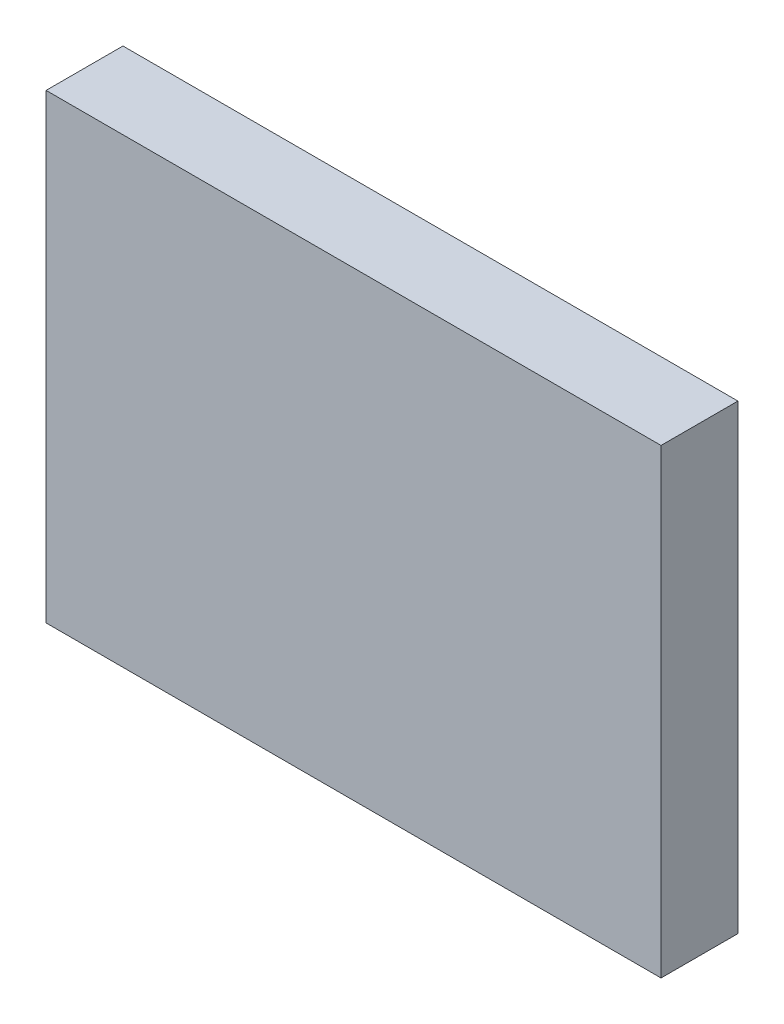
ISO-10303-21;
HEADER;
FILE_DESCRIPTION(('STEP AP214'),'2;1');
FILE_NAME('part.step','',(''),(''),'','','');
FILE_SCHEMA(('AUTOMOTIVE_DESIGN { 1 0 10303 214 1 1 1 1 }'));
ENDSEC;
DATA;
#1=APPLICATION_CONTEXT('core data for automotive mechanical design processes');
#2=APPLICATION_PROTOCOL_DEFINITION('international standard','automotive_design',2000,#1);
#3=PRODUCT_CONTEXT('',#1,'mechanical');
#4=PRODUCT('Part','Part','',(#3));
#5=PRODUCT_RELATED_PRODUCT_CATEGORY('part','',(#4));
#6=PRODUCT_DEFINITION_FORMATION('','',#4);
#7=PRODUCT_DEFINITION_CONTEXT('part definition',#1,'design');
#8=PRODUCT_DEFINITION('design','',#6,#7);
#9=PRODUCT_DEFINITION_SHAPE('','',#8);
#10=(LENGTH_UNIT() NAMED_UNIT(*) SI_UNIT(.MILLI.,.METRE.));
#11=(NAMED_UNIT(*) PLANE_ANGLE_UNIT() SI_UNIT($,.RADIAN.));
#12=(NAMED_UNIT(*) SI_UNIT($,.STERADIAN.) SOLID_ANGLE_UNIT());
#13=UNCERTAINTY_MEASURE_WITH_UNIT(LENGTH_MEASURE(1.E-05),#10,'distance_accuracy_value','');
#14=(GEOMETRIC_REPRESENTATION_CONTEXT(3) GLOBAL_UNCERTAINTY_ASSIGNED_CONTEXT((#13)) GLOBAL_UNIT_ASSIGNED_CONTEXT((#10,
#11,#12)) REPRESENTATION_CONTEXT('',''));
#15=CARTESIAN_POINT('',(0.,0.,0.));
#16=DIRECTION('',(0.,0.,1.));
#17=DIRECTION('',(1.,0.,0.));
#18=AXIS2_PLACEMENT_3D('',#15,#16,#17);
#19=CARTESIAN_POINT('',(10.16,-7.62,2.54));
#20=DIRECTION('',(0.,1.,0.));
#21=DIRECTION('',(0.,0.,1.));
#22=AXIS2_PLACEMENT_3D('',#19,#20,#21);
#23=PLANE('',#22);
#24=DIRECTION('',(1.,0.,0.));
#25=VECTOR('',#24,1.);
#26=CARTESIAN_POINT('',(10.16,-7.62,0.));
#27=LINE('',#26,#25);
#28=CARTESIAN_POINT('',(-10.16,-7.62,0.));
#29=VERTEX_POINT('',#28);
#30=CARTESIAN_POINT('',(10.16,-7.62,0.));
#31=VERTEX_POINT('',#30);
#32=EDGE_CURVE('E121',#29,#31,#27,.T.);
#33=ORIENTED_EDGE('',*,*,#32,.T.);
#34=DIRECTION('',(0.,0.,-1.));
#35=VECTOR('',#34,1.);
#36=CARTESIAN_POINT('',(10.16,-7.62,2.54));
#37=LINE('',#36,#35);
#38=CARTESIAN_POINT('',(10.16,-7.62,2.54));
#39=VERTEX_POINT('',#38);
#40=EDGE_CURVE('E11',#39,#31,#37,.T.);
#41=ORIENTED_EDGE('',*,*,#40,.F.);
#42=DIRECTION('',(1.,0.,0.));
#43=VECTOR('',#42,1.);
#44=CARTESIAN_POINT('',(10.16,-7.62,2.54));
#45=LINE('',#44,#43);
#46=CARTESIAN_POINT('',(-10.16,-7.62,2.54));
#47=VERTEX_POINT('',#46);
#48=EDGE_CURVE('E105',#47,#39,#45,.T.);
#49=ORIENTED_EDGE('',*,*,#48,.F.);
#50=DIRECTION('',(0.,0.,-1.));
#51=VECTOR('',#50,1.);
#52=CARTESIAN_POINT('',(-10.16,-7.62,2.54));
#53=LINE('',#52,#51);
#54=EDGE_CURVE('E117',#47,#29,#53,.T.);
#55=ORIENTED_EDGE('',*,*,#54,.T.);
#56=EDGE_LOOP('',(#33,#41,#49,#55));
#57=FACE_BOUND('',#56,.T.);
#58=ADVANCED_FACE('F53',(#57),#23,.F.);
#59=CARTESIAN_POINT('',(10.16,7.62,2.54));
#60=DIRECTION('',(-1.,0.,0.));
#61=DIRECTION('',(0.,-1.,0.));
#62=AXIS2_PLACEMENT_3D('',#59,#60,#61);
#63=PLANE('',#62);
#64=DIRECTION('',(0.,1.,0.));
#65=VECTOR('',#64,1.);
#66=CARTESIAN_POINT('',(10.16,7.62,0.));
#67=LINE('',#66,#65);
#68=CARTESIAN_POINT('',(10.16,7.62,0.));
#69=VERTEX_POINT('',#68);
#70=EDGE_CURVE('E110',#31,#69,#67,.T.);
#71=ORIENTED_EDGE('',*,*,#70,.T.);
#72=DIRECTION('',(0.,0.,-1.));
#73=VECTOR('',#72,1.);
#74=CARTESIAN_POINT('',(10.16,7.62,2.54));
#75=LINE('',#74,#73);
#76=CARTESIAN_POINT('',(10.16,7.62,2.54));
#77=VERTEX_POINT('',#76);
#78=EDGE_CURVE('E62',#77,#69,#75,.T.);
#79=ORIENTED_EDGE('',*,*,#78,.F.);
#80=DIRECTION('',(0.,1.,0.));
#81=VECTOR('',#80,1.);
#82=CARTESIAN_POINT('',(10.16,7.62,2.54));
#83=LINE('',#82,#81);
#84=EDGE_CURVE('E100',#39,#77,#83,.T.);
#85=ORIENTED_EDGE('',*,*,#84,.F.);
#86=ORIENTED_EDGE('',*,*,#40,.T.);
#87=EDGE_LOOP('',(#71,#79,#85,#86));
#88=FACE_BOUND('',#87,.T.);
#89=ADVANCED_FACE('F109',(#88),#63,.F.);
#90=CARTESIAN_POINT('',(10.16,7.62,2.54));
#91=DIRECTION('',(0.,-1.,0.));
#92=DIRECTION('',(0.,0.,-1.));
#93=AXIS2_PLACEMENT_3D('',#90,#91,#92);
#94=PLANE('',#93);
#95=DIRECTION('',(-1.,0.,0.));
#96=VECTOR('',#95,1.);
#97=CARTESIAN_POINT('',(10.16,7.62,0.));
#98=LINE('',#97,#96);
#99=CARTESIAN_POINT('',(-10.16,7.62,0.));
#100=VERTEX_POINT('',#99);
#101=EDGE_CURVE('E87',#69,#100,#98,.T.);
#102=ORIENTED_EDGE('',*,*,#101,.T.);
#103=DIRECTION('',(0.,0.,-1.));
#104=VECTOR('',#103,1.);
#105=CARTESIAN_POINT('',(-10.16,7.62,2.54));
#106=LINE('',#105,#104);
#107=CARTESIAN_POINT('',(-10.16,7.62,2.54));
#108=VERTEX_POINT('',#107);
#109=EDGE_CURVE('E112',#108,#100,#106,.T.);
#110=ORIENTED_EDGE('',*,*,#109,.F.);
#111=DIRECTION('',(-1.,0.,0.));
#112=VECTOR('',#111,1.);
#113=CARTESIAN_POINT('',(10.16,7.62,2.54));
#114=LINE('',#113,#112);
#115=EDGE_CURVE('E103',#77,#108,#114,.T.);
#116=ORIENTED_EDGE('',*,*,#115,.F.);
#117=ORIENTED_EDGE('',*,*,#78,.T.);
#118=EDGE_LOOP('',(#102,#110,#116,#117));
#119=FACE_BOUND('',#118,.T.);
#120=ADVANCED_FACE('F113',(#119),#94,.F.);
#121=CARTESIAN_POINT('',(-10.16,7.62,2.54));
#122=DIRECTION('',(1.,0.,0.));
#123=DIRECTION('',(0.,1.,0.));
#124=AXIS2_PLACEMENT_3D('',#121,#122,#123);
#125=PLANE('',#124);
#126=DIRECTION('',(0.,-1.,0.));
#127=VECTOR('',#126,1.);
#128=CARTESIAN_POINT('',(-10.16,7.62,0.));
#129=LINE('',#128,#127);
#130=EDGE_CURVE('E93',#100,#29,#129,.T.);
#131=ORIENTED_EDGE('',*,*,#130,.T.);
#132=ORIENTED_EDGE('',*,*,#54,.F.);
#133=DIRECTION('',(0.,-1.,0.));
#134=VECTOR('',#133,1.);
#135=CARTESIAN_POINT('',(-10.16,7.62,2.54));
#136=LINE('',#135,#134);
#137=EDGE_CURVE('E70',#108,#47,#136,.T.);
#138=ORIENTED_EDGE('',*,*,#137,.F.);
#139=ORIENTED_EDGE('',*,*,#109,.T.);
#140=EDGE_LOOP('',(#131,#132,#138,#139));
#141=FACE_BOUND('',#140,.T.);
#142=ADVANCED_FACE('F134',(#141),#125,.F.);
#143=CARTESIAN_POINT('',(0.,0.,2.54));
#144=DIRECTION('',(0.,0.,1.));
#145=DIRECTION('',(1.,0.,0.));
#146=AXIS2_PLACEMENT_3D('',#143,#144,#145);
#147=PLANE('',#146);
#148=ORIENTED_EDGE('',*,*,#48,.T.);
#149=ORIENTED_EDGE('',*,*,#84,.T.);
#150=ORIENTED_EDGE('',*,*,#115,.T.);
#151=ORIENTED_EDGE('',*,*,#137,.T.);
#152=EDGE_LOOP('',(#148,#149,#150,#151));
#153=FACE_BOUND('',#152,.T.);
#154=ADVANCED_FACE('F101',(#153),#147,.T.);
#155=CARTESIAN_POINT('',(0.,0.,0.));
#156=DIRECTION('',(0.,0.,1.));
#157=DIRECTION('',(1.,0.,0.));
#158=AXIS2_PLACEMENT_3D('',#155,#156,#157);
#159=PLANE('',#158);
#160=ORIENTED_EDGE('',*,*,#32,.F.);
#161=ORIENTED_EDGE('',*,*,#130,.F.);
#162=ORIENTED_EDGE('',*,*,#101,.F.);
#163=ORIENTED_EDGE('',*,*,#70,.F.);
#164=EDGE_LOOP('',(#160,#161,#162,#163));
#165=FACE_BOUND('',#164,.T.);
#166=ADVANCED_FACE('F137',(#165),#159,.F.);
#167=CLOSED_SHELL('',(#58,#89,#120,#142,#154,#166));
#168=MANIFOLD_SOLID_BREP('B2',#167);
#169=ADVANCED_BREP_SHAPE_REPRESENTATION('',(#18,#168),#14);
#170=SHAPE_DEFINITION_REPRESENTATION(#9,#169);
ENDSEC;
END-ISO-10303-21;
